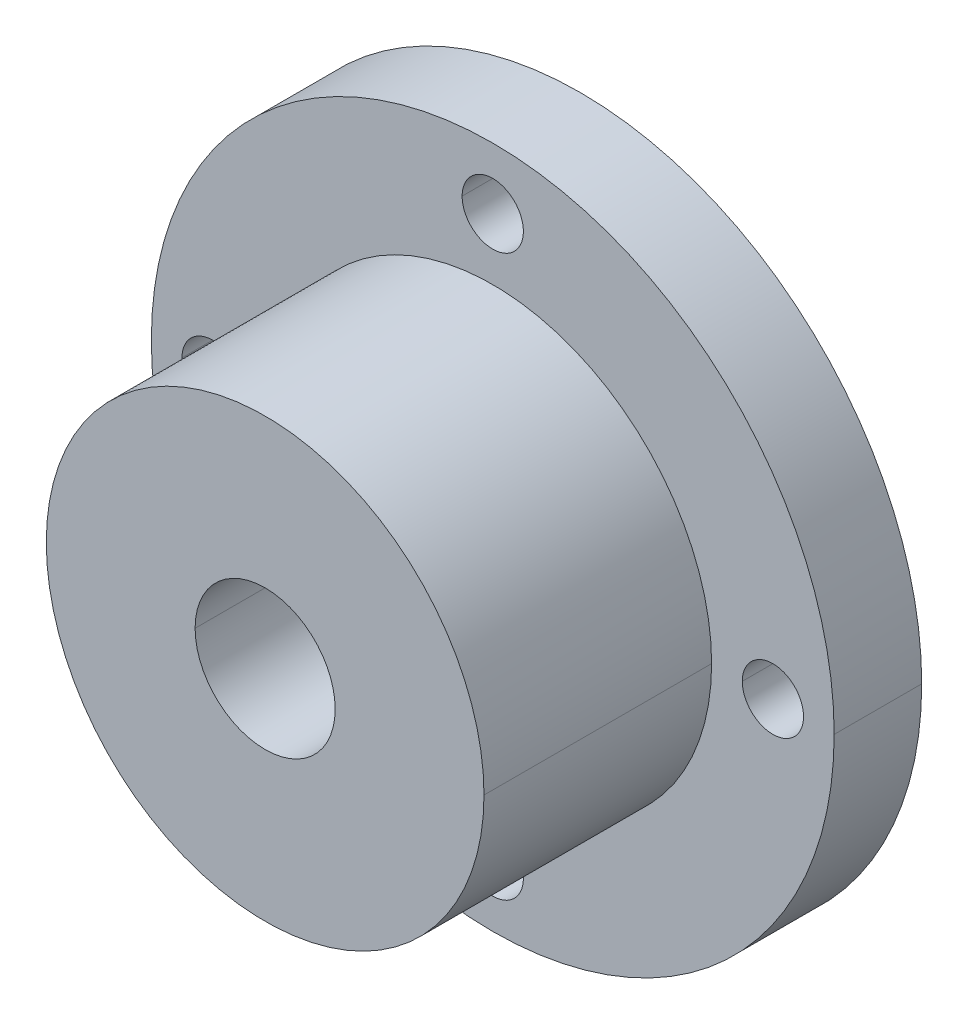
ISO-10303-21;
HEADER;
FILE_DESCRIPTION(('STEP AP214'),'2;1');
FILE_NAME('part.step','',(''),(''),'','','');
FILE_SCHEMA(('AUTOMOTIVE_DESIGN { 1 0 10303 214 1 1 1 1 }'));
ENDSEC;
DATA;
#1=APPLICATION_CONTEXT('core data for automotive mechanical design processes');
#2=APPLICATION_PROTOCOL_DEFINITION('international standard','automotive_design',2000,#1);
#3=PRODUCT_CONTEXT('',#1,'mechanical');
#4=PRODUCT('Part','Part','',(#3));
#5=PRODUCT_RELATED_PRODUCT_CATEGORY('part','',(#4));
#6=PRODUCT_DEFINITION_FORMATION('','',#4);
#7=PRODUCT_DEFINITION_CONTEXT('part definition',#1,'design');
#8=PRODUCT_DEFINITION('design','',#6,#7);
#9=PRODUCT_DEFINITION_SHAPE('','',#8);
#10=(LENGTH_UNIT() NAMED_UNIT(*) SI_UNIT(.MILLI.,.METRE.));
#11=(NAMED_UNIT(*) PLANE_ANGLE_UNIT() SI_UNIT($,.RADIAN.));
#12=(NAMED_UNIT(*) SI_UNIT($,.STERADIAN.) SOLID_ANGLE_UNIT());
#13=UNCERTAINTY_MEASURE_WITH_UNIT(LENGTH_MEASURE(1.E-05),#10,'distance_accuracy_value','');
#14=(GEOMETRIC_REPRESENTATION_CONTEXT(3) GLOBAL_UNCERTAINTY_ASSIGNED_CONTEXT((#13)) GLOBAL_UNIT_ASSIGNED_CONTEXT((#10,
#11,#12)) REPRESENTATION_CONTEXT('',''));
#15=CARTESIAN_POINT('',(0.,0.,0.));
#16=DIRECTION('',(0.,0.,1.));
#17=DIRECTION('',(1.,0.,0.));
#18=AXIS2_PLACEMENT_3D('',#15,#16,#17);
#19=CARTESIAN_POINT('',(15.9999999999993,-6.51005093941168E-13,5.));
#20=DIRECTION('',(0.,0.,-1.));
#21=DIRECTION('',(-1.,0.,0.));
#22=AXIS2_PLACEMENT_3D('',#19,#20,#21);
#23=CYLINDRICAL_SURFACE('',#22,1.75);
#24=CARTESIAN_POINT('',(15.9999999999993,-6.51005093941168E-13,5.));
#25=DIRECTION('',(0.,0.,-1.));
#26=DIRECTION('',(-1.,0.,0.));
#27=AXIS2_PLACEMENT_3D('',#24,#25,#26);
#28=CIRCLE('',#27,1.75);
#29=CARTESIAN_POINT('',(17.7499999999993,-6.50790780751317E-13,5.));
#30=VERTEX_POINT('',#29);
#31=CARTESIAN_POINT('',(14.2499999999993,-6.51005093941168E-13,5.));
#32=VERTEX_POINT('',#31);
#33=EDGE_CURVE('E42',#30,#32,#28,.T.);
#34=ORIENTED_EDGE('',*,*,#33,.F.);
#35=DIRECTION('',(0.,0.,-1.));
#36=VECTOR('',#35,1.);
#37=CARTESIAN_POINT('',(17.7499999999993,-6.50790780751317E-13,5.));
#38=LINE('',#37,#36);
#39=CARTESIAN_POINT('',(17.7499999999993,-6.50790780751317E-13,0.));
#40=VERTEX_POINT('',#39);
#41=EDGE_CURVE('E11',#30,#40,#38,.T.);
#42=ORIENTED_EDGE('',*,*,#41,.T.);
#43=CARTESIAN_POINT('',(15.9999999999993,-6.51005093941168E-13,0.));
#44=DIRECTION('',(0.,0.,-1.));
#45=DIRECTION('',(-1.,0.,0.));
#46=AXIS2_PLACEMENT_3D('',#43,#44,#45);
#47=CIRCLE('',#46,1.75);
#48=CARTESIAN_POINT('',(14.2499999999993,-6.51005093941168E-13,0.));
#49=VERTEX_POINT('',#48);
#50=EDGE_CURVE('E28',#40,#49,#47,.T.);
#51=ORIENTED_EDGE('',*,*,#50,.T.);
#52=DIRECTION('',(0.,0.,-1.));
#53=VECTOR('',#52,1.);
#54=CARTESIAN_POINT('',(14.2499999999993,-6.51005093941168E-13,5.));
#55=LINE('',#54,#53);
#56=EDGE_CURVE('E223',#32,#49,#55,.T.);
#57=ORIENTED_EDGE('',*,*,#56,.F.);
#58=EDGE_LOOP('',(#34,#42,#51,#57));
#59=FACE_BOUND('',#58,.T.);
#60=ADVANCED_FACE('F17',(#59),#23,.F.);
#61=CARTESIAN_POINT('',(-1.29809131812506E-12,-16.,5.));
#62=DIRECTION('',(0.,0.,-1.));
#63=DIRECTION('',(-1.,0.,0.));
#64=AXIS2_PLACEMENT_3D('',#61,#62,#63);
#65=CYLINDRICAL_SURFACE('',#64,1.75);
#66=CARTESIAN_POINT('',(-1.29809131812506E-12,-16.,5.));
#67=DIRECTION('',(0.,0.,-1.));
#68=DIRECTION('',(-1.,0.,0.));
#69=AXIS2_PLACEMENT_3D('',#66,#67,#68);
#70=CIRCLE('',#69,1.75);
#71=CARTESIAN_POINT('',(1.7499999999987,-16.,5.));
#72=VERTEX_POINT('',#71);
#73=CARTESIAN_POINT('',(-1.7500000000013,-16.,5.));
#74=VERTEX_POINT('',#73);
#75=EDGE_CURVE('E193',#72,#74,#70,.T.);
#76=ORIENTED_EDGE('',*,*,#75,.F.);
#77=DIRECTION('',(0.,0.,-1.));
#78=VECTOR('',#77,1.);
#79=CARTESIAN_POINT('',(1.7499999999987,-16.,5.));
#80=LINE('',#79,#78);
#81=CARTESIAN_POINT('',(1.7499999999987,-16.,0.));
#82=VERTEX_POINT('',#81);
#83=EDGE_CURVE('E212',#72,#82,#80,.T.);
#84=ORIENTED_EDGE('',*,*,#83,.T.);
#85=CARTESIAN_POINT('',(-1.29809131812506E-12,-16.,0.));
#86=DIRECTION('',(0.,0.,-1.));
#87=DIRECTION('',(-1.,0.,0.));
#88=AXIS2_PLACEMENT_3D('',#85,#86,#87);
#89=CIRCLE('',#88,1.75);
#90=CARTESIAN_POINT('',(-1.7500000000013,-16.,0.));
#91=VERTEX_POINT('',#90);
#92=EDGE_CURVE('E202',#82,#91,#89,.T.);
#93=ORIENTED_EDGE('',*,*,#92,.T.);
#94=DIRECTION('',(0.,0.,-1.));
#95=VECTOR('',#94,1.);
#96=CARTESIAN_POINT('',(-1.7500000000013,-16.,5.));
#97=LINE('',#96,#95);
#98=EDGE_CURVE('E178',#74,#91,#97,.T.);
#99=ORIENTED_EDGE('',*,*,#98,.F.);
#100=EDGE_LOOP('',(#76,#84,#93,#99));
#101=FACE_BOUND('',#100,.T.);
#102=ADVANCED_FACE('F341',(#101),#65,.F.);
#103=CARTESIAN_POINT('',(-16.0000000000007,6.49045659062533E-13,5.));
#104=DIRECTION('',(0.,0.,-1.));
#105=DIRECTION('',(-1.,0.,0.));
#106=AXIS2_PLACEMENT_3D('',#103,#104,#105);
#107=CYLINDRICAL_SURFACE('',#106,1.75);
#108=CARTESIAN_POINT('',(-16.0000000000007,6.49045659062533E-13,5.));
#109=DIRECTION('',(0.,0.,-1.));
#110=DIRECTION('',(-1.,0.,0.));
#111=AXIS2_PLACEMENT_3D('',#108,#109,#110);
#112=CIRCLE('',#111,1.75);
#113=CARTESIAN_POINT('',(-14.2500000000006,6.49259972252383E-13,5.));
#114=VERTEX_POINT('',#113);
#115=CARTESIAN_POINT('',(-17.7500000000006,6.49045659062533E-13,5.));
#116=VERTEX_POINT('',#115);
#117=EDGE_CURVE('E207',#114,#116,#112,.T.);
#118=ORIENTED_EDGE('',*,*,#117,.F.);
#119=DIRECTION('',(0.,0.,-1.));
#120=VECTOR('',#119,1.);
#121=CARTESIAN_POINT('',(-14.2500000000006,6.49259972252383E-13,5.));
#122=LINE('',#121,#120);
#123=CARTESIAN_POINT('',(-14.2500000000006,6.49259972252383E-13,0.));
#124=VERTEX_POINT('',#123);
#125=EDGE_CURVE('E170',#114,#124,#122,.T.);
#126=ORIENTED_EDGE('',*,*,#125,.T.);
#127=CARTESIAN_POINT('',(-16.0000000000007,6.49045659062533E-13,0.));
#128=DIRECTION('',(0.,0.,-1.));
#129=DIRECTION('',(-1.,0.,0.));
#130=AXIS2_PLACEMENT_3D('',#127,#128,#129);
#131=CIRCLE('',#130,1.75);
#132=CARTESIAN_POINT('',(-17.7500000000006,6.49045659062533E-13,0.));
#133=VERTEX_POINT('',#132);
#134=EDGE_CURVE('E168',#124,#133,#131,.T.);
#135=ORIENTED_EDGE('',*,*,#134,.T.);
#136=DIRECTION('',(0.,0.,-1.));
#137=VECTOR('',#136,1.);
#138=CARTESIAN_POINT('',(-17.7500000000006,6.49045659062533E-13,5.));
#139=LINE('',#138,#137);
#140=EDGE_CURVE('E154',#116,#133,#139,.T.);
#141=ORIENTED_EDGE('',*,*,#140,.F.);
#142=EDGE_LOOP('',(#118,#126,#135,#141));
#143=FACE_BOUND('',#142,.T.);
#144=ADVANCED_FACE('F169',(#143),#107,.F.);
#145=CARTESIAN_POINT('',(0.,16.,5.));
#146=DIRECTION('',(0.,0.,-1.));
#147=DIRECTION('',(-1.,0.,0.));
#148=AXIS2_PLACEMENT_3D('',#145,#146,#147);
#149=CYLINDRICAL_SURFACE('',#148,1.75);
#150=CARTESIAN_POINT('',(0.,16.,5.));
#151=DIRECTION('',(0.,0.,-1.));
#152=DIRECTION('',(-1.,0.,0.));
#153=AXIS2_PLACEMENT_3D('',#150,#151,#152);
#154=CIRCLE('',#153,1.75);
#155=CARTESIAN_POINT('',(1.75,16.,5.));
#156=VERTEX_POINT('',#155);
#157=CARTESIAN_POINT('',(-1.75,16.,5.));
#158=VERTEX_POINT('',#157);
#159=EDGE_CURVE('E208',#156,#158,#154,.T.);
#160=ORIENTED_EDGE('',*,*,#159,.F.);
#161=DIRECTION('',(0.,0.,-1.));
#162=VECTOR('',#161,1.);
#163=CARTESIAN_POINT('',(1.75,16.,5.));
#164=LINE('',#163,#162);
#165=CARTESIAN_POINT('',(1.75,16.,0.));
#166=VERTEX_POINT('',#165);
#167=EDGE_CURVE('E173',#156,#166,#164,.T.);
#168=ORIENTED_EDGE('',*,*,#167,.T.);
#169=CARTESIAN_POINT('',(0.,16.,0.));
#170=DIRECTION('',(0.,0.,-1.));
#171=DIRECTION('',(-1.,0.,0.));
#172=AXIS2_PLACEMENT_3D('',#169,#170,#171);
#173=CIRCLE('',#172,1.75);
#174=CARTESIAN_POINT('',(-1.75,16.,0.));
#175=VERTEX_POINT('',#174);
#176=EDGE_CURVE('E233',#166,#175,#173,.T.);
#177=ORIENTED_EDGE('',*,*,#176,.T.);
#178=DIRECTION('',(0.,0.,-1.));
#179=VECTOR('',#178,1.);
#180=CARTESIAN_POINT('',(-1.75,16.,5.));
#181=LINE('',#180,#179);
#182=EDGE_CURVE('E251',#158,#175,#181,.T.);
#183=ORIENTED_EDGE('',*,*,#182,.F.);
#184=EDGE_LOOP('',(#160,#168,#177,#183));
#185=FACE_BOUND('',#184,.T.);
#186=ADVANCED_FACE('F535',(#185),#149,.F.);
#187=CARTESIAN_POINT('',(0.,0.,5.));
#188=DIRECTION('',(0.,0.,-1.));
#189=DIRECTION('',(-1.,0.,0.));
#190=AXIS2_PLACEMENT_3D('',#187,#188,#189);
#191=CYLINDRICAL_SURFACE('',#190,19.5);
#192=CARTESIAN_POINT('',(0.,0.,5.));
#193=DIRECTION('',(0.,0.,-1.));
#194=DIRECTION('',(-1.,0.,0.));
#195=AXIS2_PLACEMENT_3D('',#192,#193,#194);
#196=CIRCLE('',#195,19.5);
#197=CARTESIAN_POINT('',(-19.5,0.,5.));
#198=VERTEX_POINT('',#197);
#199=CARTESIAN_POINT('',(19.5,0.,5.));
#200=VERTEX_POINT('',#199);
#201=EDGE_CURVE('E280',#198,#200,#196,.T.);
#202=ORIENTED_EDGE('',*,*,#201,.T.);
#203=DIRECTION('',(0.,0.,-1.));
#204=VECTOR('',#203,1.);
#205=CARTESIAN_POINT('',(19.5,0.,5.));
#206=LINE('',#205,#204);
#207=CARTESIAN_POINT('',(19.5,0.,0.));
#208=VERTEX_POINT('',#207);
#209=EDGE_CURVE('E258',#200,#208,#206,.T.);
#210=ORIENTED_EDGE('',*,*,#209,.T.);
#211=CARTESIAN_POINT('',(0.,0.,0.));
#212=DIRECTION('',(0.,0.,-1.));
#213=DIRECTION('',(-1.,0.,0.));
#214=AXIS2_PLACEMENT_3D('',#211,#212,#213);
#215=CIRCLE('',#214,19.5);
#216=CARTESIAN_POINT('',(-19.5,0.,0.));
#217=VERTEX_POINT('',#216);
#218=EDGE_CURVE('E194',#217,#208,#215,.T.);
#219=ORIENTED_EDGE('',*,*,#218,.F.);
#220=DIRECTION('',(0.,0.,-1.));
#221=VECTOR('',#220,1.);
#222=CARTESIAN_POINT('',(-19.5,0.,5.));
#223=LINE('',#222,#221);
#224=EDGE_CURVE('E243',#198,#217,#223,.T.);
#225=ORIENTED_EDGE('',*,*,#224,.F.);
#226=EDGE_LOOP('',(#202,#210,#219,#225));
#227=FACE_BOUND('',#226,.T.);
#228=ADVANCED_FACE('F361',(#227),#191,.T.);
#229=CARTESIAN_POINT('',(0.,0.,18.));
#230=DIRECTION('',(0.,0.,-1.));
#231=DIRECTION('',(-1.,0.,0.));
#232=AXIS2_PLACEMENT_3D('',#229,#230,#231);
#233=CYLINDRICAL_SURFACE('',#232,4.);
#234=CARTESIAN_POINT('',(0.,0.,18.));
#235=DIRECTION('',(0.,0.,1.));
#236=DIRECTION('',(1.,0.,0.));
#237=AXIS2_PLACEMENT_3D('',#234,#235,#236);
#238=CIRCLE('',#237,4.);
#239=CARTESIAN_POINT('',(-4.,0.,18.));
#240=VERTEX_POINT('',#239);
#241=CARTESIAN_POINT('',(4.,0.,18.));
#242=VERTEX_POINT('',#241);
#243=EDGE_CURVE('E238',#240,#242,#238,.T.);
#244=ORIENTED_EDGE('',*,*,#243,.T.);
#245=DIRECTION('',(0.,0.,-1.));
#246=VECTOR('',#245,1.);
#247=CARTESIAN_POINT('',(4.,0.,18.));
#248=LINE('',#247,#246);
#249=CARTESIAN_POINT('',(4.,0.,0.));
#250=VERTEX_POINT('',#249);
#251=EDGE_CURVE('E234',#242,#250,#248,.T.);
#252=ORIENTED_EDGE('',*,*,#251,.T.);
#253=CARTESIAN_POINT('',(0.,0.,0.));
#254=DIRECTION('',(0.,0.,1.));
#255=DIRECTION('',(1.,0.,0.));
#256=AXIS2_PLACEMENT_3D('',#253,#254,#255);
#257=CIRCLE('',#256,4.);
#258=CARTESIAN_POINT('',(-4.,0.,0.));
#259=VERTEX_POINT('',#258);
#260=EDGE_CURVE('E217',#259,#250,#257,.T.);
#261=ORIENTED_EDGE('',*,*,#260,.F.);
#262=DIRECTION('',(0.,0.,-1.));
#263=VECTOR('',#262,1.);
#264=CARTESIAN_POINT('',(-4.,0.,18.));
#265=LINE('',#264,#263);
#266=EDGE_CURVE('E259',#240,#259,#265,.T.);
#267=ORIENTED_EDGE('',*,*,#266,.F.);
#268=EDGE_LOOP('',(#244,#252,#261,#267));
#269=FACE_BOUND('',#268,.T.);
#270=ADVANCED_FACE('F19',(#269),#233,.F.);
#271=CARTESIAN_POINT('',(0.,0.,18.));
#272=DIRECTION('',(0.,0.,-1.));
#273=DIRECTION('',(-1.,0.,0.));
#274=AXIS2_PLACEMENT_3D('',#271,#272,#273);
#275=CYLINDRICAL_SURFACE('',#274,12.5);
#276=CARTESIAN_POINT('',(0.,0.,18.));
#277=DIRECTION('',(0.,0.,1.));
#278=DIRECTION('',(1.,0.,0.));
#279=AXIS2_PLACEMENT_3D('',#276,#277,#278);
#280=CIRCLE('',#279,12.5);
#281=CARTESIAN_POINT('',(12.5,0.,18.));
#282=VERTEX_POINT('',#281);
#283=CARTESIAN_POINT('',(-12.5,0.,18.));
#284=VERTEX_POINT('',#283);
#285=EDGE_CURVE('E198',#282,#284,#280,.T.);
#286=ORIENTED_EDGE('',*,*,#285,.F.);
#287=DIRECTION('',(0.,0.,-1.));
#288=VECTOR('',#287,1.);
#289=CARTESIAN_POINT('',(12.5,0.,18.));
#290=LINE('',#289,#288);
#291=CARTESIAN_POINT('',(12.5,0.,5.));
#292=VERTEX_POINT('',#291);
#293=EDGE_CURVE('E239',#282,#292,#290,.T.);
#294=ORIENTED_EDGE('',*,*,#293,.T.);
#295=CARTESIAN_POINT('',(0.,0.,5.));
#296=DIRECTION('',(0.,0.,-1.));
#297=DIRECTION('',(-1.,0.,0.));
#298=AXIS2_PLACEMENT_3D('',#295,#296,#297);
#299=CIRCLE('',#298,12.5);
#300=CARTESIAN_POINT('',(-12.5,0.,5.));
#301=VERTEX_POINT('',#300);
#302=EDGE_CURVE('E89',#301,#292,#299,.T.);
#303=ORIENTED_EDGE('',*,*,#302,.F.);
#304=DIRECTION('',(0.,0.,-1.));
#305=VECTOR('',#304,1.);
#306=CARTESIAN_POINT('',(-12.5,0.,18.));
#307=LINE('',#306,#305);
#308=EDGE_CURVE('E253',#284,#301,#307,.T.);
#309=ORIENTED_EDGE('',*,*,#308,.F.);
#310=EDGE_LOOP('',(#286,#294,#303,#309));
#311=FACE_BOUND('',#310,.T.);
#312=ADVANCED_FACE('F356',(#311),#275,.T.);
#313=CARTESIAN_POINT('',(0.,0.,18.));
#314=DIRECTION('',(0.,0.,-1.));
#315=DIRECTION('',(-1.,0.,0.));
#316=AXIS2_PLACEMENT_3D('',#313,#314,#315);
#317=CYLINDRICAL_SURFACE('',#316,12.5);
#318=ORIENTED_EDGE('',*,*,#293,.F.);
#319=CARTESIAN_POINT('',(0.,0.,18.));
#320=DIRECTION('',(0.,0.,1.));
#321=DIRECTION('',(1.,0.,0.));
#322=AXIS2_PLACEMENT_3D('',#319,#320,#321);
#323=CIRCLE('',#322,12.5);
#324=EDGE_CURVE('E262',#284,#282,#323,.T.);
#325=ORIENTED_EDGE('',*,*,#324,.F.);
#326=ORIENTED_EDGE('',*,*,#308,.T.);
#327=CARTESIAN_POINT('',(0.,0.,5.));
#328=DIRECTION('',(0.,0.,-1.));
#329=DIRECTION('',(-1.,0.,0.));
#330=AXIS2_PLACEMENT_3D('',#327,#328,#329);
#331=CIRCLE('',#330,12.5);
#332=EDGE_CURVE('E242',#292,#301,#331,.T.);
#333=ORIENTED_EDGE('',*,*,#332,.F.);
#334=EDGE_LOOP('',(#318,#325,#326,#333));
#335=FACE_BOUND('',#334,.T.);
#336=ADVANCED_FACE('F320',(#335),#317,.T.);
#337=CARTESIAN_POINT('',(0.,0.,18.));
#338=DIRECTION('',(0.,0.,1.));
#339=DIRECTION('',(1.,0.,0.));
#340=AXIS2_PLACEMENT_3D('',#337,#338,#339);
#341=PLANE('',#340);
#342=ORIENTED_EDGE('',*,*,#324,.T.);
#343=ORIENTED_EDGE('',*,*,#285,.T.);
#344=EDGE_LOOP('',(#342,#343));
#345=FACE_BOUND('',#344,.T.);
#346=ORIENTED_EDGE('',*,*,#243,.F.);
#347=CARTESIAN_POINT('',(0.,0.,18.));
#348=DIRECTION('',(0.,0.,1.));
#349=DIRECTION('',(1.,0.,0.));
#350=AXIS2_PLACEMENT_3D('',#347,#348,#349);
#351=CIRCLE('',#350,4.);
#352=EDGE_CURVE('E218',#242,#240,#351,.T.);
#353=ORIENTED_EDGE('',*,*,#352,.F.);
#354=EDGE_LOOP('',(#346,#353));
#355=FACE_BOUND('',#354,.T.);
#356=ADVANCED_FACE('F350',(#345,#355),#341,.T.);
#357=CARTESIAN_POINT('',(0.,0.,0.));
#358=DIRECTION('',(0.,0.,1.));
#359=DIRECTION('',(1.,0.,0.));
#360=AXIS2_PLACEMENT_3D('',#357,#358,#359);
#361=PLANE('',#360);
#362=ORIENTED_EDGE('',*,*,#218,.T.);
#363=CARTESIAN_POINT('',(0.,0.,0.));
#364=DIRECTION('',(0.,0.,-1.));
#365=DIRECTION('',(-1.,0.,0.));
#366=AXIS2_PLACEMENT_3D('',#363,#364,#365);
#367=CIRCLE('',#366,19.5);
#368=EDGE_CURVE('E199',#208,#217,#367,.T.);
#369=ORIENTED_EDGE('',*,*,#368,.T.);
#370=EDGE_LOOP('',(#362,#369));
#371=FACE_BOUND('',#370,.T.);
#372=ORIENTED_EDGE('',*,*,#260,.T.);
#373=CARTESIAN_POINT('',(0.,0.,0.));
#374=DIRECTION('',(0.,0.,1.));
#375=DIRECTION('',(1.,0.,0.));
#376=AXIS2_PLACEMENT_3D('',#373,#374,#375);
#377=CIRCLE('',#376,4.);
#378=EDGE_CURVE('E213',#250,#259,#377,.T.);
#379=ORIENTED_EDGE('',*,*,#378,.T.);
#380=EDGE_LOOP('',(#372,#379));
#381=FACE_BOUND('',#380,.T.);
#382=CARTESIAN_POINT('',(15.9999999999993,-6.51005093941168E-13,0.));
#383=DIRECTION('',(0.,0.,-1.));
#384=DIRECTION('',(-1.,0.,0.));
#385=AXIS2_PLACEMENT_3D('',#382,#383,#384);
#386=CIRCLE('',#385,1.75);
#387=EDGE_CURVE('E219',#49,#40,#386,.T.);
#388=ORIENTED_EDGE('',*,*,#387,.F.);
#389=ORIENTED_EDGE('',*,*,#50,.F.);
#390=EDGE_LOOP('',(#388,#389));
#391=FACE_BOUND('',#390,.T.);
#392=CARTESIAN_POINT('',(-1.29809131812506E-12,-16.,0.));
#393=DIRECTION('',(0.,0.,-1.));
#394=DIRECTION('',(-1.,0.,0.));
#395=AXIS2_PLACEMENT_3D('',#392,#393,#394);
#396=CIRCLE('',#395,1.75);
#397=EDGE_CURVE('E185',#91,#82,#396,.T.);
#398=ORIENTED_EDGE('',*,*,#397,.F.);
#399=ORIENTED_EDGE('',*,*,#92,.F.);
#400=EDGE_LOOP('',(#398,#399));
#401=FACE_BOUND('',#400,.T.);
#402=CARTESIAN_POINT('',(-16.0000000000007,6.49045659062533E-13,0.));
#403=DIRECTION('',(0.,0.,-1.));
#404=DIRECTION('',(-1.,0.,0.));
#405=AXIS2_PLACEMENT_3D('',#402,#403,#404);
#406=CIRCLE('',#405,1.75);
#407=EDGE_CURVE('E159',#133,#124,#406,.T.);
#408=ORIENTED_EDGE('',*,*,#407,.F.);
#409=ORIENTED_EDGE('',*,*,#134,.F.);
#410=EDGE_LOOP('',(#408,#409));
#411=FACE_BOUND('',#410,.T.);
#412=CARTESIAN_POINT('',(0.,16.,0.));
#413=DIRECTION('',(0.,0.,-1.));
#414=DIRECTION('',(-1.,0.,0.));
#415=AXIS2_PLACEMENT_3D('',#412,#413,#414);
#416=CIRCLE('',#415,1.75);
#417=EDGE_CURVE('E165',#175,#166,#416,.T.);
#418=ORIENTED_EDGE('',*,*,#417,.F.);
#419=ORIENTED_EDGE('',*,*,#176,.F.);
#420=EDGE_LOOP('',(#418,#419));
#421=FACE_BOUND('',#420,.T.);
#422=ADVANCED_FACE('F175',(#371,#381,#391,#401,#411,#421),#361,.F.);
#423=CARTESIAN_POINT('',(0.,0.,18.));
#424=DIRECTION('',(0.,0.,-1.));
#425=DIRECTION('',(-1.,0.,0.));
#426=AXIS2_PLACEMENT_3D('',#423,#424,#425);
#427=CYLINDRICAL_SURFACE('',#426,4.);
#428=ORIENTED_EDGE('',*,*,#251,.F.);
#429=ORIENTED_EDGE('',*,*,#352,.T.);
#430=ORIENTED_EDGE('',*,*,#266,.T.);
#431=ORIENTED_EDGE('',*,*,#378,.F.);
#432=EDGE_LOOP('',(#428,#429,#430,#431));
#433=FACE_BOUND('',#432,.T.);
#434=ADVANCED_FACE('F334',(#433),#427,.F.);
#435=CARTESIAN_POINT('',(0.,0.,5.));
#436=DIRECTION('',(0.,0.,-1.));
#437=DIRECTION('',(-1.,0.,0.));
#438=AXIS2_PLACEMENT_3D('',#435,#436,#437);
#439=CYLINDRICAL_SURFACE('',#438,19.5);
#440=ORIENTED_EDGE('',*,*,#209,.F.);
#441=CARTESIAN_POINT('',(0.,0.,5.));
#442=DIRECTION('',(0.,0.,-1.));
#443=DIRECTION('',(-1.,0.,0.));
#444=AXIS2_PLACEMENT_3D('',#441,#442,#443);
#445=CIRCLE('',#444,19.5);
#446=EDGE_CURVE('E246',#200,#198,#445,.T.);
#447=ORIENTED_EDGE('',*,*,#446,.T.);
#448=ORIENTED_EDGE('',*,*,#224,.T.);
#449=ORIENTED_EDGE('',*,*,#368,.F.);
#450=EDGE_LOOP('',(#440,#447,#448,#449));
#451=FACE_BOUND('',#450,.T.);
#452=ADVANCED_FACE('F324',(#451),#439,.T.);
#453=CARTESIAN_POINT('',(0.,0.,5.));
#454=DIRECTION('',(0.,0.,-1.));
#455=DIRECTION('',(0.,-1.,0.));
#456=AXIS2_PLACEMENT_3D('',#453,#454,#455);
#457=PLANE('',#456);
#458=ORIENTED_EDGE('',*,*,#201,.F.);
#459=ORIENTED_EDGE('',*,*,#446,.F.);
#460=EDGE_LOOP('',(#458,#459));
#461=FACE_BOUND('',#460,.T.);
#462=CARTESIAN_POINT('',(15.9999999999993,-6.51005093941168E-13,5.));
#463=DIRECTION('',(0.,0.,-1.));
#464=DIRECTION('',(-1.,0.,0.));
#465=AXIS2_PLACEMENT_3D('',#462,#463,#464);
#466=CIRCLE('',#465,1.75);
#467=EDGE_CURVE('E21',#32,#30,#466,.T.);
#468=ORIENTED_EDGE('',*,*,#467,.T.);
#469=ORIENTED_EDGE('',*,*,#33,.T.);
#470=EDGE_LOOP('',(#468,#469));
#471=FACE_BOUND('',#470,.T.);
#472=CARTESIAN_POINT('',(-1.29809131812506E-12,-16.,5.));
#473=DIRECTION('',(0.,0.,-1.));
#474=DIRECTION('',(-1.,0.,0.));
#475=AXIS2_PLACEMENT_3D('',#472,#473,#474);
#476=CIRCLE('',#475,1.75);
#477=EDGE_CURVE('E190',#74,#72,#476,.T.);
#478=ORIENTED_EDGE('',*,*,#477,.T.);
#479=ORIENTED_EDGE('',*,*,#75,.T.);
#480=EDGE_LOOP('',(#478,#479));
#481=FACE_BOUND('',#480,.T.);
#482=CARTESIAN_POINT('',(-16.0000000000007,6.49045659062533E-13,5.));
#483=DIRECTION('',(0.,0.,-1.));
#484=DIRECTION('',(-1.,0.,0.));
#485=AXIS2_PLACEMENT_3D('',#482,#483,#484);
#486=CIRCLE('',#485,1.75);
#487=EDGE_CURVE('E161',#116,#114,#486,.T.);
#488=ORIENTED_EDGE('',*,*,#487,.T.);
#489=ORIENTED_EDGE('',*,*,#117,.T.);
#490=EDGE_LOOP('',(#488,#489));
#491=FACE_BOUND('',#490,.T.);
#492=CARTESIAN_POINT('',(0.,16.,5.));
#493=DIRECTION('',(0.,0.,-1.));
#494=DIRECTION('',(-1.,0.,0.));
#495=AXIS2_PLACEMENT_3D('',#492,#493,#494);
#496=CIRCLE('',#495,1.75);
#497=EDGE_CURVE('E203',#158,#156,#496,.T.);
#498=ORIENTED_EDGE('',*,*,#497,.T.);
#499=ORIENTED_EDGE('',*,*,#159,.T.);
#500=EDGE_LOOP('',(#498,#499));
#501=FACE_BOUND('',#500,.T.);
#502=ORIENTED_EDGE('',*,*,#302,.T.);
#503=ORIENTED_EDGE('',*,*,#332,.T.);
#504=EDGE_LOOP('',(#502,#503));
#505=FACE_BOUND('',#504,.T.);
#506=ADVANCED_FACE('F321',(#461,#471,#481,#491,#501,#505),#457,.F.);
#507=CARTESIAN_POINT('',(0.,16.,5.));
#508=DIRECTION('',(0.,0.,-1.));
#509=DIRECTION('',(-1.,0.,0.));
#510=AXIS2_PLACEMENT_3D('',#507,#508,#509);
#511=CYLINDRICAL_SURFACE('',#510,1.75);
#512=ORIENTED_EDGE('',*,*,#167,.F.);
#513=ORIENTED_EDGE('',*,*,#497,.F.);
#514=ORIENTED_EDGE('',*,*,#182,.T.);
#515=ORIENTED_EDGE('',*,*,#417,.T.);
#516=EDGE_LOOP('',(#512,#513,#514,#515));
#517=FACE_BOUND('',#516,.T.);
#518=ADVANCED_FACE('F323',(#517),#511,.F.);
#519=CARTESIAN_POINT('',(-16.0000000000007,6.49045659062533E-13,5.));
#520=DIRECTION('',(0.,0.,-1.));
#521=DIRECTION('',(-1.,0.,0.));
#522=AXIS2_PLACEMENT_3D('',#519,#520,#521);
#523=CYLINDRICAL_SURFACE('',#522,1.75);
#524=ORIENTED_EDGE('',*,*,#125,.F.);
#525=ORIENTED_EDGE('',*,*,#487,.F.);
#526=ORIENTED_EDGE('',*,*,#140,.T.);
#527=ORIENTED_EDGE('',*,*,#407,.T.);
#528=EDGE_LOOP('',(#524,#525,#526,#527));
#529=FACE_BOUND('',#528,.T.);
#530=ADVANCED_FACE('F157',(#529),#523,.F.);
#531=CARTESIAN_POINT('',(-1.29809131812506E-12,-16.,5.));
#532=DIRECTION('',(0.,0.,-1.));
#533=DIRECTION('',(-1.,0.,0.));
#534=AXIS2_PLACEMENT_3D('',#531,#532,#533);
#535=CYLINDRICAL_SURFACE('',#534,1.75);
#536=ORIENTED_EDGE('',*,*,#83,.F.);
#537=ORIENTED_EDGE('',*,*,#477,.F.);
#538=ORIENTED_EDGE('',*,*,#98,.T.);
#539=ORIENTED_EDGE('',*,*,#397,.T.);
#540=EDGE_LOOP('',(#536,#537,#538,#539));
#541=FACE_BOUND('',#540,.T.);
#542=ADVANCED_FACE('F384',(#541),#535,.F.);
#543=CARTESIAN_POINT('',(15.9999999999993,-6.51005093941168E-13,5.));
#544=DIRECTION('',(0.,0.,-1.));
#545=DIRECTION('',(-1.,0.,0.));
#546=AXIS2_PLACEMENT_3D('',#543,#544,#545);
#547=CYLINDRICAL_SURFACE('',#546,1.75);
#548=ORIENTED_EDGE('',*,*,#41,.F.);
#549=ORIENTED_EDGE('',*,*,#467,.F.);
#550=ORIENTED_EDGE('',*,*,#56,.T.);
#551=ORIENTED_EDGE('',*,*,#387,.T.);
#552=EDGE_LOOP('',(#548,#549,#550,#551));
#553=FACE_BOUND('',#552,.T.);
#554=ADVANCED_FACE('F560',(#553),#547,.F.);
#555=CLOSED_SHELL('',(#60,#102,#144,#186,#228,#270,#312,#336,#356,#422,#434,#452,#506,#518,#530,
#542,#554));
#556=MANIFOLD_SOLID_BREP('B1',#555);
#557=ADVANCED_BREP_SHAPE_REPRESENTATION('',(#18,#556),#14);
#558=SHAPE_DEFINITION_REPRESENTATION(#9,#557);
ENDSEC;
END-ISO-10303-21;
